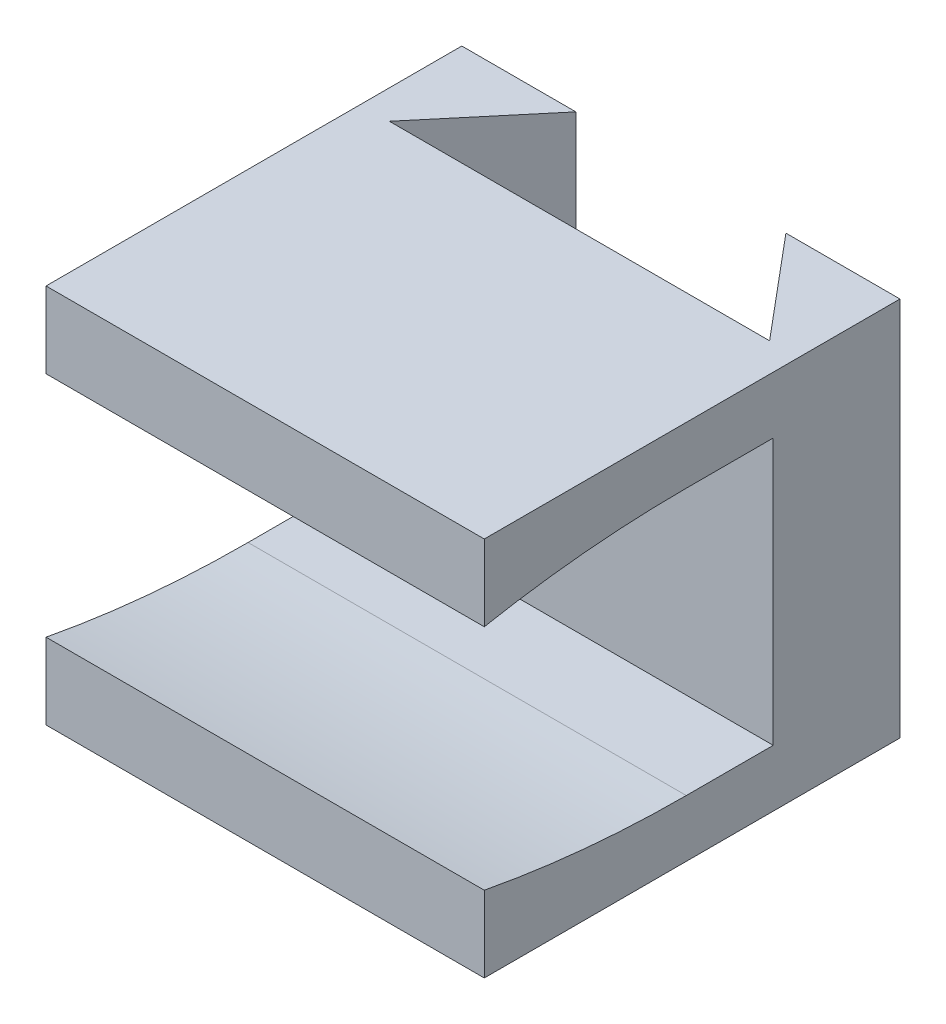
ISO-10303-21;
HEADER;
FILE_DESCRIPTION(('STEP AP214'),'2;1');
FILE_NAME('part.step','',(''),(''),'','','');
FILE_SCHEMA(('AUTOMOTIVE_DESIGN { 1 0 10303 214 1 1 1 1 }'));
ENDSEC;
DATA;
#1=APPLICATION_CONTEXT('core data for automotive mechanical design processes');
#2=APPLICATION_PROTOCOL_DEFINITION('international standard','automotive_design',2000,#1);
#3=PRODUCT_CONTEXT('',#1,'mechanical');
#4=PRODUCT('Part','Part','',(#3));
#5=PRODUCT_RELATED_PRODUCT_CATEGORY('part','',(#4));
#6=PRODUCT_DEFINITION_FORMATION('','',#4);
#7=PRODUCT_DEFINITION_CONTEXT('part definition',#1,'design');
#8=PRODUCT_DEFINITION('design','',#6,#7);
#9=PRODUCT_DEFINITION_SHAPE('','',#8);
#10=(LENGTH_UNIT() NAMED_UNIT(*) SI_UNIT(.MILLI.,.METRE.));
#11=(NAMED_UNIT(*) PLANE_ANGLE_UNIT() SI_UNIT($,.RADIAN.));
#12=(NAMED_UNIT(*) SI_UNIT($,.STERADIAN.) SOLID_ANGLE_UNIT());
#13=UNCERTAINTY_MEASURE_WITH_UNIT(LENGTH_MEASURE(1.E-05),#10,'distance_accuracy_value','');
#14=(GEOMETRIC_REPRESENTATION_CONTEXT(3) GLOBAL_UNCERTAINTY_ASSIGNED_CONTEXT((#13)) GLOBAL_UNIT_ASSIGNED_CONTEXT((#10,
#11,#12)) REPRESENTATION_CONTEXT('',''));
#15=CARTESIAN_POINT('',(0.,0.,0.));
#16=DIRECTION('',(0.,0.,1.));
#17=DIRECTION('',(1.,0.,0.));
#18=AXIS2_PLACEMENT_3D('',#15,#16,#17);
#19=CARTESIAN_POINT('',(0.,15.,0.));
#20=DIRECTION('',(-0.766044443118979,0.,-0.642787609686538));
#21=DIRECTION('',(-0.642787609686538,0.,0.766044443118979));
#22=AXIS2_PLACEMENT_3D('',#19,#20,#21);
#23=PLANE('',#22);
#24=DIRECTION('',(0.642787609686538,0.,-0.766044443118979));
#25=VECTOR('',#24,1.);
#26=CARTESIAN_POINT('',(0.,0.,0.));
#27=LINE('',#26,#25);
#28=CARTESIAN_POINT('',(0.,0.,0.));
#29=VERTEX_POINT('',#28);
#30=CARTESIAN_POINT('',(3.35639852470911,0.,-4.));
#31=VERTEX_POINT('',#30);
#32=EDGE_CURVE('E141',#29,#31,#27,.T.);
#33=ORIENTED_EDGE('',*,*,#32,.T.);
#34=DIRECTION('',(0.,-1.,0.));
#35=VECTOR('',#34,1.);
#36=CARTESIAN_POINT('',(3.35639852470911,15.,-4.));
#37=LINE('',#36,#35);
#38=CARTESIAN_POINT('',(3.35639852470911,15.,-4.));
#39=VERTEX_POINT('',#38);
#40=EDGE_CURVE('E46',#39,#31,#37,.T.);
#41=ORIENTED_EDGE('',*,*,#40,.F.);
#42=DIRECTION('',(0.642787609686538,0.,-0.766044443118979));
#43=VECTOR('',#42,1.);
#44=CARTESIAN_POINT('',(0.,15.,0.));
#45=LINE('',#44,#43);
#46=CARTESIAN_POINT('',(0.,15.,0.));
#47=VERTEX_POINT('',#46);
#48=EDGE_CURVE('E157',#47,#39,#45,.T.);
#49=ORIENTED_EDGE('',*,*,#48,.F.);
#50=DIRECTION('',(0.,-1.,0.));
#51=VECTOR('',#50,1.);
#52=CARTESIAN_POINT('',(0.,15.,0.));
#53=LINE('',#52,#51);
#54=EDGE_CURVE('E137',#47,#29,#53,.T.);
#55=ORIENTED_EDGE('',*,*,#54,.T.);
#56=EDGE_LOOP('',(#33,#41,#49,#55));
#57=FACE_BOUND('',#56,.T.);
#58=ADVANCED_FACE('F43',(#57),#23,.F.);
#59=CARTESIAN_POINT('',(-1.14360147529089,15.,-4.));
#60=DIRECTION('',(0.,0.,1.));
#61=DIRECTION('',(1.,0.,0.));
#62=AXIS2_PLACEMENT_3D('',#59,#60,#61);
#63=PLANE('',#62);
#64=DIRECTION('',(-1.,0.,0.));
#65=VECTOR('',#64,1.);
#66=CARTESIAN_POINT('',(-1.14360147529089,0.,-4.));
#67=LINE('',#66,#65);
#68=CARTESIAN_POINT('',(-1.14360147529089,0.,-4.));
#69=VERTEX_POINT('',#68);
#70=EDGE_CURVE('E144',#31,#69,#67,.T.);
#71=ORIENTED_EDGE('',*,*,#70,.T.);
#72=DIRECTION('',(0.,-1.,0.));
#73=VECTOR('',#72,1.);
#74=CARTESIAN_POINT('',(-1.14360147529089,15.,-4.));
#75=LINE('',#74,#73);
#76=CARTESIAN_POINT('',(-1.14360147529089,15.,-4.));
#77=VERTEX_POINT('',#76);
#78=EDGE_CURVE('E165',#77,#69,#75,.T.);
#79=ORIENTED_EDGE('',*,*,#78,.F.);
#80=DIRECTION('',(-1.,0.,0.));
#81=VECTOR('',#80,1.);
#82=CARTESIAN_POINT('',(3.35639852470911,15.,-4.));
#83=LINE('',#82,#81);
#84=EDGE_CURVE('E104',#39,#77,#83,.T.);
#85=ORIENTED_EDGE('',*,*,#84,.F.);
#86=ORIENTED_EDGE('',*,*,#40,.T.);
#87=EDGE_LOOP('',(#71,#79,#85,#86));
#88=FACE_BOUND('',#87,.T.);
#89=ADVANCED_FACE('F172',(#88),#63,.F.);
#90=CARTESIAN_POINT('',(-1.14360147529089,15.,1.));
#91=DIRECTION('',(1.,0.,0.));
#92=DIRECTION('',(0.,0.,-1.));
#93=AXIS2_PLACEMENT_3D('',#90,#91,#92);
#94=PLANE('',#93);
#95=DIRECTION('',(0.,0.,1.));
#96=VECTOR('',#95,1.);
#97=CARTESIAN_POINT('',(-1.14360147529089,0.,1.));
#98=LINE('',#97,#96);
#99=CARTESIAN_POINT('',(-1.14360147529089,0.,1.));
#100=VERTEX_POINT('',#99);
#101=EDGE_CURVE('E147',#69,#100,#98,.T.);
#102=ORIENTED_EDGE('',*,*,#101,.T.);
#103=DIRECTION('',(0.,-1.,0.));
#104=VECTOR('',#103,1.);
#105=CARTESIAN_POINT('',(-1.14360147529089,15.,1.));
#106=LINE('',#105,#104);
#107=CARTESIAN_POINT('',(-1.14360147529089,2.25,1.));
#108=VERTEX_POINT('',#107);
#109=EDGE_CURVE('E162',#108,#100,#106,.T.);
#110=ORIENTED_EDGE('',*,*,#109,.F.);
#111=CARTESIAN_POINT('',(-1.14360147529089,12.75,1.));
#112=VERTEX_POINT('',#111);
#113=EDGE_CURVE('E166',#112,#108,#106,.T.);
#114=ORIENTED_EDGE('',*,*,#113,.F.);
#115=CARTESIAN_POINT('',(-1.14360147529089,15.,1.));
#116=VERTEX_POINT('',#115);
#117=EDGE_CURVE('E163',#116,#112,#106,.T.);
#118=ORIENTED_EDGE('',*,*,#117,.F.);
#119=DIRECTION('',(0.,0.,1.));
#120=VECTOR('',#119,1.);
#121=CARTESIAN_POINT('',(-1.14360147529089,15.,1.));
#122=LINE('',#121,#120);
#123=EDGE_CURVE('E282',#77,#116,#122,.T.);
#124=ORIENTED_EDGE('',*,*,#123,.F.);
#125=ORIENTED_EDGE('',*,*,#78,.T.);
#126=EDGE_LOOP('',(#102,#110,#114,#118,#124,#125));
#127=FACE_BOUND('',#126,.T.);
#128=ADVANCED_FACE('F183',(#127),#94,.F.);
#129=CARTESIAN_POINT('',(16.1436014752909,15.,1.));
#130=DIRECTION('',(0.,0.,-1.));
#131=DIRECTION('',(-1.,0.,0.));
#132=AXIS2_PLACEMENT_3D('',#129,#130,#131);
#133=PLANE('',#132);
#134=DIRECTION('',(0.,-1.,0.));
#135=VECTOR('',#134,1.);
#136=CARTESIAN_POINT('',(16.1436014752909,15.,1.));
#137=LINE('',#136,#135);
#138=CARTESIAN_POINT('',(16.1436014752909,12.75,1.));
#139=VERTEX_POINT('',#138);
#140=CARTESIAN_POINT('',(16.1436014752909,2.25,1.));
#141=VERTEX_POINT('',#140);
#142=EDGE_CURVE('E59',#139,#141,#137,.T.);
#143=ORIENTED_EDGE('',*,*,#142,.F.);
#144=DIRECTION('',(1.,0.,0.));
#145=VECTOR('',#144,1.);
#146=CARTESIAN_POINT('',(-1.14639852470911,12.75,1.));
#147=LINE('',#146,#145);
#148=EDGE_CURVE('E247',#112,#139,#147,.T.);
#149=ORIENTED_EDGE('',*,*,#148,.F.);
#150=ORIENTED_EDGE('',*,*,#113,.T.);
#151=DIRECTION('',(1.,0.,0.));
#152=VECTOR('',#151,1.);
#153=CARTESIAN_POINT('',(-1.14639852470911,2.25,1.));
#154=LINE('',#153,#152);
#155=EDGE_CURVE('E11',#108,#141,#154,.T.);
#156=ORIENTED_EDGE('',*,*,#155,.T.);
#157=EDGE_LOOP('',(#143,#149,#150,#156));
#158=FACE_BOUND('',#157,.T.);
#159=ADVANCED_FACE('F261',(#158),#133,.F.);
#160=CARTESIAN_POINT('',(16.1436014752909,15.,-4.));
#161=DIRECTION('',(-1.,0.,0.));
#162=DIRECTION('',(0.,0.,1.));
#163=AXIS2_PLACEMENT_3D('',#160,#161,#162);
#164=PLANE('',#163);
#165=DIRECTION('',(0.,0.,-1.));
#166=VECTOR('',#165,1.);
#167=CARTESIAN_POINT('',(16.1436014752909,0.,-4.));
#168=LINE('',#167,#166);
#169=CARTESIAN_POINT('',(16.1436014752909,0.,12.4));
#170=VERTEX_POINT('',#169);
#171=CARTESIAN_POINT('',(16.1436014752909,0.,-4.));
#172=VERTEX_POINT('',#171);
#173=EDGE_CURVE('E150',#170,#172,#168,.T.);
#174=ORIENTED_EDGE('',*,*,#173,.T.);
#175=DIRECTION('',(0.,-1.,0.));
#176=VECTOR('',#175,1.);
#177=CARTESIAN_POINT('',(16.1436014752909,15.,-4.));
#178=LINE('',#177,#176);
#179=CARTESIAN_POINT('',(16.1436014752909,15.,-4.));
#180=VERTEX_POINT('',#179);
#181=EDGE_CURVE('E132',#180,#172,#178,.T.);
#182=ORIENTED_EDGE('',*,*,#181,.F.);
#183=DIRECTION('',(0.,0.,-1.));
#184=VECTOR('',#183,1.);
#185=CARTESIAN_POINT('',(16.1436014752909,15.,-4.));
#186=LINE('',#185,#184);
#187=CARTESIAN_POINT('',(16.1436014752909,15.,12.4));
#188=VERTEX_POINT('',#187);
#189=EDGE_CURVE('E121',#188,#180,#186,.T.);
#190=ORIENTED_EDGE('',*,*,#189,.F.);
#191=DIRECTION('',(0.,-1.,0.));
#192=VECTOR('',#191,1.);
#193=CARTESIAN_POINT('',(16.1436014752909,15.,12.4));
#194=LINE('',#193,#192);
#195=CARTESIAN_POINT('',(16.1436014752909,12.,12.4));
#196=VERTEX_POINT('',#195);
#197=EDGE_CURVE('E304',#188,#196,#194,.T.);
#198=ORIENTED_EDGE('',*,*,#197,.T.);
#199=CARTESIAN_POINT('',(16.1436014752909,-29.9722666666665,4.43));
#200=DIRECTION('',(-1.,0.,0.));
#201=DIRECTION('',(0.,0.,-1.));
#202=AXIS2_PLACEMENT_3D('',#199,#200,#201);
#203=CIRCLE('',#202,42.7222666666665);
#204=CARTESIAN_POINT('',(16.1436014752909,12.75,4.43));
#205=VERTEX_POINT('',#204);
#206=EDGE_CURVE('E258',#196,#205,#203,.T.);
#207=ORIENTED_EDGE('',*,*,#206,.T.);
#208=DIRECTION('',(0.,0.,-1.));
#209=VECTOR('',#208,1.);
#210=CARTESIAN_POINT('',(16.1436014752909,12.75,1.));
#211=LINE('',#210,#209);
#212=EDGE_CURVE('E249',#205,#139,#211,.T.);
#213=ORIENTED_EDGE('',*,*,#212,.T.);
#214=ORIENTED_EDGE('',*,*,#142,.T.);
#215=DIRECTION('',(0.,0.,1.));
#216=VECTOR('',#215,1.);
#217=CARTESIAN_POINT('',(16.1436014752909,2.25,1.));
#218=LINE('',#217,#216);
#219=CARTESIAN_POINT('',(16.1436014752909,2.25,4.43));
#220=VERTEX_POINT('',#219);
#221=EDGE_CURVE('E267',#141,#220,#218,.T.);
#222=ORIENTED_EDGE('',*,*,#221,.T.);
#223=CARTESIAN_POINT('',(16.1436014752909,44.9722666666665,4.43000000000001));
#224=DIRECTION('',(-1.,0.,0.));
#225=DIRECTION('',(0.,0.,1.));
#226=AXIS2_PLACEMENT_3D('',#223,#224,#225);
#227=CIRCLE('',#226,42.7222666666665);
#228=CARTESIAN_POINT('',(16.1436014752909,3.,12.4));
#229=VERTEX_POINT('',#228);
#230=EDGE_CURVE('E324',#220,#229,#227,.T.);
#231=ORIENTED_EDGE('',*,*,#230,.T.);
#232=DIRECTION('',(0.,-1.,0.));
#233=VECTOR('',#232,1.);
#234=CARTESIAN_POINT('',(16.1436014752909,0.,12.4));
#235=LINE('',#234,#233);
#236=EDGE_CURVE('E316',#229,#170,#235,.T.);
#237=ORIENTED_EDGE('',*,*,#236,.T.);
#238=EDGE_LOOP('',(#174,#182,#190,#198,#207,#213,#214,#222,#231,#237));
#239=FACE_BOUND('',#238,.T.);
#240=ADVANCED_FACE('F255',(#239),#164,.F.);
#241=CARTESIAN_POINT('',(11.6436014752909,15.,-4.));
#242=DIRECTION('',(0.,0.,1.));
#243=DIRECTION('',(1.,0.,0.));
#244=AXIS2_PLACEMENT_3D('',#241,#242,#243);
#245=PLANE('',#244);
#246=DIRECTION('',(-1.,0.,0.));
#247=VECTOR('',#246,1.);
#248=CARTESIAN_POINT('',(11.6436014752909,0.,-4.));
#249=LINE('',#248,#247);
#250=CARTESIAN_POINT('',(11.6436014752909,0.,-4.));
#251=VERTEX_POINT('',#250);
#252=EDGE_CURVE('E129',#172,#251,#249,.T.);
#253=ORIENTED_EDGE('',*,*,#252,.T.);
#254=DIRECTION('',(0.,-1.,0.));
#255=VECTOR('',#254,1.);
#256=CARTESIAN_POINT('',(11.6436014752909,15.,-4.));
#257=LINE('',#256,#255);
#258=CARTESIAN_POINT('',(11.6436014752909,15.,-4.));
#259=VERTEX_POINT('',#258);
#260=EDGE_CURVE('E127',#259,#251,#257,.T.);
#261=ORIENTED_EDGE('',*,*,#260,.F.);
#262=DIRECTION('',(-1.,0.,0.));
#263=VECTOR('',#262,1.);
#264=CARTESIAN_POINT('',(13.1436014752909,15.,-4.));
#265=LINE('',#264,#263);
#266=EDGE_CURVE('E113',#180,#259,#265,.T.);
#267=ORIENTED_EDGE('',*,*,#266,.F.);
#268=ORIENTED_EDGE('',*,*,#181,.T.);
#269=EDGE_LOOP('',(#253,#261,#267,#268));
#270=FACE_BOUND('',#269,.T.);
#271=ADVANCED_FACE('F128',(#270),#245,.F.);
#272=CARTESIAN_POINT('',(15.,15.,0.));
#273=DIRECTION('',(0.766044443118979,0.,-0.642787609686538));
#274=DIRECTION('',(-0.642787609686538,0.,-0.766044443118979));
#275=AXIS2_PLACEMENT_3D('',#272,#273,#274);
#276=PLANE('',#275);
#277=DIRECTION('',(0.642787609686538,0.,0.766044443118979));
#278=VECTOR('',#277,1.);
#279=CARTESIAN_POINT('',(15.,0.,0.));
#280=LINE('',#279,#278);
#281=CARTESIAN_POINT('',(15.,0.,0.));
#282=VERTEX_POINT('',#281);
#283=EDGE_CURVE('E154',#251,#282,#280,.T.);
#284=ORIENTED_EDGE('',*,*,#283,.T.);
#285=DIRECTION('',(0.,-1.,0.));
#286=VECTOR('',#285,1.);
#287=CARTESIAN_POINT('',(15.,15.,0.));
#288=LINE('',#287,#286);
#289=CARTESIAN_POINT('',(15.,15.,0.));
#290=VERTEX_POINT('',#289);
#291=EDGE_CURVE('E133',#290,#282,#288,.T.);
#292=ORIENTED_EDGE('',*,*,#291,.F.);
#293=DIRECTION('',(0.642787609686538,0.,0.766044443118979));
#294=VECTOR('',#293,1.);
#295=CARTESIAN_POINT('',(15.,15.,0.));
#296=LINE('',#295,#294);
#297=EDGE_CURVE('E117',#259,#290,#296,.T.);
#298=ORIENTED_EDGE('',*,*,#297,.F.);
#299=ORIENTED_EDGE('',*,*,#260,.T.);
#300=EDGE_LOOP('',(#284,#292,#298,#299));
#301=FACE_BOUND('',#300,.T.);
#302=ADVANCED_FACE('F135',(#301),#276,.F.);
#303=CARTESIAN_POINT('',(0.,15.,0.));
#304=DIRECTION('',(0.,0.,1.));
#305=DIRECTION('',(1.,0.,0.));
#306=AXIS2_PLACEMENT_3D('',#303,#304,#305);
#307=PLANE('',#306);
#308=DIRECTION('',(-1.,0.,0.));
#309=VECTOR('',#308,1.);
#310=CARTESIAN_POINT('',(0.,0.,0.));
#311=LINE('',#310,#309);
#312=EDGE_CURVE('E95',#282,#29,#311,.T.);
#313=ORIENTED_EDGE('',*,*,#312,.T.);
#314=ORIENTED_EDGE('',*,*,#54,.F.);
#315=DIRECTION('',(-1.,0.,0.));
#316=VECTOR('',#315,1.);
#317=CARTESIAN_POINT('',(0.,15.,0.));
#318=LINE('',#317,#316);
#319=EDGE_CURVE('E68',#290,#47,#318,.T.);
#320=ORIENTED_EDGE('',*,*,#319,.F.);
#321=ORIENTED_EDGE('',*,*,#291,.T.);
#322=EDGE_LOOP('',(#313,#314,#320,#321));
#323=FACE_BOUND('',#322,.T.);
#324=ADVANCED_FACE('F340',(#323),#307,.F.);
#325=CARTESIAN_POINT('',(0.,15.,0.));
#326=DIRECTION('',(0.,1.,0.));
#327=DIRECTION('',(0.,0.,1.));
#328=AXIS2_PLACEMENT_3D('',#325,#326,#327);
#329=PLANE('',#328);
#330=ORIENTED_EDGE('',*,*,#48,.T.);
#331=ORIENTED_EDGE('',*,*,#84,.T.);
#332=ORIENTED_EDGE('',*,*,#123,.T.);
#333=DIRECTION('',(1.,0.,0.));
#334=VECTOR('',#333,1.);
#335=CARTESIAN_POINT('',(-1.14639852470911,15.,1.));
#336=LINE('',#335,#334);
#337=CARTESIAN_POINT('',(-1.14639852470911,15.,1.));
#338=VERTEX_POINT('',#337);
#339=EDGE_CURVE('E286',#338,#116,#336,.T.);
#340=ORIENTED_EDGE('',*,*,#339,.F.);
#341=DIRECTION('',(0.,0.,1.));
#342=VECTOR('',#341,1.);
#343=CARTESIAN_POINT('',(-1.14639852470911,15.,1.));
#344=LINE('',#343,#342);
#345=CARTESIAN_POINT('',(-1.14639852470911,15.,12.4));
#346=VERTEX_POINT('',#345);
#347=EDGE_CURVE('E311',#338,#346,#344,.T.);
#348=ORIENTED_EDGE('',*,*,#347,.T.);
#349=DIRECTION('',(1.,0.,0.));
#350=VECTOR('',#349,1.);
#351=CARTESIAN_POINT('',(-1.14639852470911,15.,12.4));
#352=LINE('',#351,#350);
#353=EDGE_CURVE('E293',#346,#188,#352,.T.);
#354=ORIENTED_EDGE('',*,*,#353,.T.);
#355=ORIENTED_EDGE('',*,*,#189,.T.);
#356=ORIENTED_EDGE('',*,*,#266,.T.);
#357=ORIENTED_EDGE('',*,*,#297,.T.);
#358=ORIENTED_EDGE('',*,*,#319,.T.);
#359=EDGE_LOOP('',(#330,#331,#332,#340,#348,#354,#355,#356,#357,#358));
#360=FACE_BOUND('',#359,.T.);
#361=ADVANCED_FACE('F115',(#360),#329,.T.);
#362=CARTESIAN_POINT('',(0.,0.,0.));
#363=DIRECTION('',(0.,1.,0.));
#364=DIRECTION('',(0.,0.,1.));
#365=AXIS2_PLACEMENT_3D('',#362,#363,#364);
#366=PLANE('',#365);
#367=ORIENTED_EDGE('',*,*,#32,.F.);
#368=ORIENTED_EDGE('',*,*,#312,.F.);
#369=ORIENTED_EDGE('',*,*,#283,.F.);
#370=ORIENTED_EDGE('',*,*,#252,.F.);
#371=ORIENTED_EDGE('',*,*,#173,.F.);
#372=DIRECTION('',(1.,0.,0.));
#373=VECTOR('',#372,1.);
#374=CARTESIAN_POINT('',(-1.14639852470911,0.,12.4));
#375=LINE('',#374,#373);
#376=CARTESIAN_POINT('',(-1.14639852470911,0.,12.4));
#377=VERTEX_POINT('',#376);
#378=EDGE_CURVE('E330',#377,#170,#375,.T.);
#379=ORIENTED_EDGE('',*,*,#378,.F.);
#380=DIRECTION('',(0.,0.,-1.));
#381=VECTOR('',#380,1.);
#382=CARTESIAN_POINT('',(-1.14639852470911,0.,1.));
#383=LINE('',#382,#381);
#384=CARTESIAN_POINT('',(-1.14639852470911,0.,1.));
#385=VERTEX_POINT('',#384);
#386=EDGE_CURVE('E273',#377,#385,#383,.T.);
#387=ORIENTED_EDGE('',*,*,#386,.T.);
#388=DIRECTION('',(1.,0.,0.));
#389=VECTOR('',#388,1.);
#390=CARTESIAN_POINT('',(-1.14639852470911,0.,1.));
#391=LINE('',#390,#389);
#392=EDGE_CURVE('E145',#385,#100,#391,.T.);
#393=ORIENTED_EDGE('',*,*,#392,.T.);
#394=ORIENTED_EDGE('',*,*,#101,.F.);
#395=ORIENTED_EDGE('',*,*,#70,.F.);
#396=EDGE_LOOP('',(#367,#368,#369,#370,#371,#379,#387,#393,#394,#395));
#397=FACE_BOUND('',#396,.T.);
#398=ADVANCED_FACE('F177',(#397),#366,.F.);
#399=CARTESIAN_POINT('',(-1.14639852470911,2.25,1.));
#400=DIRECTION('',(0.,0.,-1.));
#401=DIRECTION('',(-1.,0.,0.));
#402=AXIS2_PLACEMENT_3D('',#399,#400,#401);
#403=PLANE('',#402);
#404=CARTESIAN_POINT('',(-1.14639852470911,2.25,1.));
#405=VERTEX_POINT('',#404);
#406=EDGE_CURVE('E52',#405,#108,#154,.T.);
#407=ORIENTED_EDGE('',*,*,#406,.T.);
#408=ORIENTED_EDGE('',*,*,#109,.T.);
#409=ORIENTED_EDGE('',*,*,#392,.F.);
#410=DIRECTION('',(0.,1.,0.));
#411=VECTOR('',#410,1.);
#412=CARTESIAN_POINT('',(-1.14639852470911,2.25,1.));
#413=LINE('',#412,#411);
#414=EDGE_CURVE('E271',#385,#405,#413,.T.);
#415=ORIENTED_EDGE('',*,*,#414,.T.);
#416=EDGE_LOOP('',(#407,#408,#409,#415));
#417=FACE_BOUND('',#416,.T.);
#418=ADVANCED_FACE('F269',(#417),#403,.T.);
#419=CARTESIAN_POINT('',(-1.14639852470911,0.,12.4));
#420=DIRECTION('',(0.,0.,1.));
#421=DIRECTION('',(1.,0.,0.));
#422=AXIS2_PLACEMENT_3D('',#419,#420,#421);
#423=PLANE('',#422);
#424=ORIENTED_EDGE('',*,*,#236,.F.);
#425=DIRECTION('',(1.,0.,0.));
#426=VECTOR('',#425,1.);
#427=CARTESIAN_POINT('',(-1.14639852470911,3.,12.4));
#428=LINE('',#427,#426);
#429=CARTESIAN_POINT('',(-1.14639852470911,3.,12.4));
#430=VERTEX_POINT('',#429);
#431=EDGE_CURVE('E274',#430,#229,#428,.T.);
#432=ORIENTED_EDGE('',*,*,#431,.F.);
#433=DIRECTION('',(0.,-1.,0.));
#434=VECTOR('',#433,1.);
#435=CARTESIAN_POINT('',(-1.14639852470911,0.,12.4));
#436=LINE('',#435,#434);
#437=EDGE_CURVE('E276',#430,#377,#436,.T.);
#438=ORIENTED_EDGE('',*,*,#437,.T.);
#439=ORIENTED_EDGE('',*,*,#378,.T.);
#440=EDGE_LOOP('',(#424,#432,#438,#439));
#441=FACE_BOUND('',#440,.T.);
#442=ADVANCED_FACE('F339',(#441),#423,.T.);
#443=CARTESIAN_POINT('',(-1.14639852470911,44.9722666666665,4.43000000000001));
#444=DIRECTION('',(1.,0.,0.));
#445=DIRECTION('',(0.,0.,-1.));
#446=AXIS2_PLACEMENT_3D('',#443,#444,#445);
#447=CYLINDRICAL_SURFACE('',#446,42.7222666666665);
#448=ORIENTED_EDGE('',*,*,#230,.F.);
#449=DIRECTION('',(1.,0.,0.));
#450=VECTOR('',#449,1.);
#451=CARTESIAN_POINT('',(-1.14639852470911,2.25,4.43));
#452=LINE('',#451,#450);
#453=CARTESIAN_POINT('',(-1.14639852470911,2.25,4.43));
#454=VERTEX_POINT('',#453);
#455=EDGE_CURVE('E272',#454,#220,#452,.T.);
#456=ORIENTED_EDGE('',*,*,#455,.F.);
#457=CARTESIAN_POINT('',(-1.14639852470911,44.9722666666665,4.43000000000001));
#458=DIRECTION('',(-1.,0.,0.));
#459=DIRECTION('',(0.,0.,1.));
#460=AXIS2_PLACEMENT_3D('',#457,#458,#459);
#461=CIRCLE('',#460,42.7222666666665);
#462=EDGE_CURVE('E318',#454,#430,#461,.T.);
#463=ORIENTED_EDGE('',*,*,#462,.T.);
#464=ORIENTED_EDGE('',*,*,#431,.T.);
#465=EDGE_LOOP('',(#448,#456,#463,#464));
#466=FACE_BOUND('',#465,.T.);
#467=ADVANCED_FACE('F335',(#466),#447,.F.);
#468=CARTESIAN_POINT('',(-1.14639852470911,2.25,1.));
#469=DIRECTION('',(0.,1.,0.));
#470=DIRECTION('',(0.,0.,1.));
#471=AXIS2_PLACEMENT_3D('',#468,#469,#470);
#472=PLANE('',#471);
#473=ORIENTED_EDGE('',*,*,#221,.F.);
#474=ORIENTED_EDGE('',*,*,#155,.F.);
#475=ORIENTED_EDGE('',*,*,#406,.F.);
#476=DIRECTION('',(0.,0.,1.));
#477=VECTOR('',#476,1.);
#478=CARTESIAN_POINT('',(-1.14639852470911,2.25,1.));
#479=LINE('',#478,#477);
#480=EDGE_CURVE('E315',#405,#454,#479,.T.);
#481=ORIENTED_EDGE('',*,*,#480,.T.);
#482=ORIENTED_EDGE('',*,*,#455,.T.);
#483=EDGE_LOOP('',(#473,#474,#475,#481,#482));
#484=FACE_BOUND('',#483,.T.);
#485=ADVANCED_FACE('F264',(#484),#472,.T.);
#486=CARTESIAN_POINT('',(-1.14639852470911,44.9722666666665,4.43000000000001));
#487=DIRECTION('',(-1.,0.,0.));
#488=DIRECTION('',(0.,0.,1.));
#489=AXIS2_PLACEMENT_3D('',#486,#487,#488);
#490=PLANE('',#489);
#491=ORIENTED_EDGE('',*,*,#414,.F.);
#492=ORIENTED_EDGE('',*,*,#386,.F.);
#493=ORIENTED_EDGE('',*,*,#437,.F.);
#494=ORIENTED_EDGE('',*,*,#462,.F.);
#495=ORIENTED_EDGE('',*,*,#480,.F.);
#496=EDGE_LOOP('',(#491,#492,#493,#494,#495));
#497=FACE_BOUND('',#496,.T.);
#498=ADVANCED_FACE('F437',(#497),#490,.T.);
#499=CARTESIAN_POINT('',(-1.14639852470911,12.75,1.));
#500=DIRECTION('',(0.,0.,-1.));
#501=DIRECTION('',(-1.,0.,0.));
#502=AXIS2_PLACEMENT_3D('',#499,#500,#501);
#503=PLANE('',#502);
#504=ORIENTED_EDGE('',*,*,#117,.T.);
#505=CARTESIAN_POINT('',(-1.14639852470911,12.75,1.));
#506=VERTEX_POINT('',#505);
#507=EDGE_CURVE('E251',#506,#112,#147,.T.);
#508=ORIENTED_EDGE('',*,*,#507,.F.);
#509=DIRECTION('',(0.,1.,0.));
#510=VECTOR('',#509,1.);
#511=CARTESIAN_POINT('',(-1.14639852470911,12.75,1.));
#512=LINE('',#511,#510);
#513=EDGE_CURVE('E259',#506,#338,#512,.T.);
#514=ORIENTED_EDGE('',*,*,#513,.T.);
#515=ORIENTED_EDGE('',*,*,#339,.T.);
#516=EDGE_LOOP('',(#504,#508,#514,#515));
#517=FACE_BOUND('',#516,.T.);
#518=ADVANCED_FACE('F289',(#517),#503,.T.);
#519=CARTESIAN_POINT('',(-1.14639852470911,12.75,1.));
#520=DIRECTION('',(0.,-1.,0.));
#521=DIRECTION('',(0.,0.,-1.));
#522=AXIS2_PLACEMENT_3D('',#519,#520,#521);
#523=PLANE('',#522);
#524=ORIENTED_EDGE('',*,*,#212,.F.);
#525=DIRECTION('',(1.,0.,0.));
#526=VECTOR('',#525,1.);
#527=CARTESIAN_POINT('',(-1.14639852470911,12.75,4.43));
#528=LINE('',#527,#526);
#529=CARTESIAN_POINT('',(-1.14639852470911,12.75,4.43));
#530=VERTEX_POINT('',#529);
#531=EDGE_CURVE('E301',#530,#205,#528,.T.);
#532=ORIENTED_EDGE('',*,*,#531,.F.);
#533=DIRECTION('',(0.,0.,-1.));
#534=VECTOR('',#533,1.);
#535=CARTESIAN_POINT('',(-1.14639852470911,12.75,1.));
#536=LINE('',#535,#534);
#537=EDGE_CURVE('E292',#530,#506,#536,.T.);
#538=ORIENTED_EDGE('',*,*,#537,.T.);
#539=ORIENTED_EDGE('',*,*,#507,.T.);
#540=ORIENTED_EDGE('',*,*,#148,.T.);
#541=EDGE_LOOP('',(#524,#532,#538,#539,#540));
#542=FACE_BOUND('',#541,.T.);
#543=ADVANCED_FACE('F248',(#542),#523,.T.);
#544=CARTESIAN_POINT('',(-1.14639852470911,-29.9722666666665,4.43));
#545=DIRECTION('',(1.,0.,0.));
#546=DIRECTION('',(0.,0.,-1.));
#547=AXIS2_PLACEMENT_3D('',#544,#545,#546);
#548=CYLINDRICAL_SURFACE('',#547,42.7222666666665);
#549=ORIENTED_EDGE('',*,*,#206,.F.);
#550=DIRECTION('',(1.,0.,0.));
#551=VECTOR('',#550,1.);
#552=CARTESIAN_POINT('',(-1.14639852470911,12.,12.4));
#553=LINE('',#552,#551);
#554=CARTESIAN_POINT('',(-1.14639852470911,12.,12.4));
#555=VERTEX_POINT('',#554);
#556=EDGE_CURVE('E297',#555,#196,#553,.T.);
#557=ORIENTED_EDGE('',*,*,#556,.F.);
#558=CARTESIAN_POINT('',(-1.14639852470911,-29.9722666666665,4.43));
#559=DIRECTION('',(-1.,0.,0.));
#560=DIRECTION('',(0.,0.,-1.));
#561=AXIS2_PLACEMENT_3D('',#558,#559,#560);
#562=CIRCLE('',#561,42.7222666666665);
#563=EDGE_CURVE('E295',#555,#530,#562,.T.);
#564=ORIENTED_EDGE('',*,*,#563,.T.);
#565=ORIENTED_EDGE('',*,*,#531,.T.);
#566=EDGE_LOOP('',(#549,#557,#564,#565));
#567=FACE_BOUND('',#566,.T.);
#568=ADVANCED_FACE('F460',(#567),#548,.F.);
#569=CARTESIAN_POINT('',(-1.14639852470911,15.,12.4));
#570=DIRECTION('',(0.,0.,1.));
#571=DIRECTION('',(0.,-1.,0.));
#572=AXIS2_PLACEMENT_3D('',#569,#570,#571);
#573=PLANE('',#572);
#574=ORIENTED_EDGE('',*,*,#197,.F.);
#575=ORIENTED_EDGE('',*,*,#353,.F.);
#576=DIRECTION('',(0.,-1.,0.));
#577=VECTOR('',#576,1.);
#578=CARTESIAN_POINT('',(-1.14639852470911,15.,12.4));
#579=LINE('',#578,#577);
#580=EDGE_CURVE('E308',#346,#555,#579,.T.);
#581=ORIENTED_EDGE('',*,*,#580,.T.);
#582=ORIENTED_EDGE('',*,*,#556,.T.);
#583=EDGE_LOOP('',(#574,#575,#581,#582));
#584=FACE_BOUND('',#583,.T.);
#585=ADVANCED_FACE('F468',(#584),#573,.T.);
#586=CARTESIAN_POINT('',(-1.14639852470911,-29.9722666666665,4.43));
#587=DIRECTION('',(1.,0.,0.));
#588=DIRECTION('',(0.,0.,-1.));
#589=AXIS2_PLACEMENT_3D('',#586,#587,#588);
#590=PLANE('',#589);
#591=ORIENTED_EDGE('',*,*,#513,.F.);
#592=ORIENTED_EDGE('',*,*,#537,.F.);
#593=ORIENTED_EDGE('',*,*,#563,.F.);
#594=ORIENTED_EDGE('',*,*,#580,.F.);
#595=ORIENTED_EDGE('',*,*,#347,.F.);
#596=EDGE_LOOP('',(#591,#592,#593,#594,#595));
#597=FACE_BOUND('',#596,.T.);
#598=ADVANCED_FACE('F477',(#597),#590,.F.);
#599=CLOSED_SHELL('',(#58,#89,#128,#159,#240,#271,#302,#324,#361,#398,#418,#442,#467,#485,#498,
#518,#543,#568,#585,#598));
#600=MANIFOLD_SOLID_BREP('B2',#599);
#601=ADVANCED_BREP_SHAPE_REPRESENTATION('',(#18,#600),#14);
#602=SHAPE_DEFINITION_REPRESENTATION(#9,#601);
ENDSEC;
END-ISO-10303-21;
